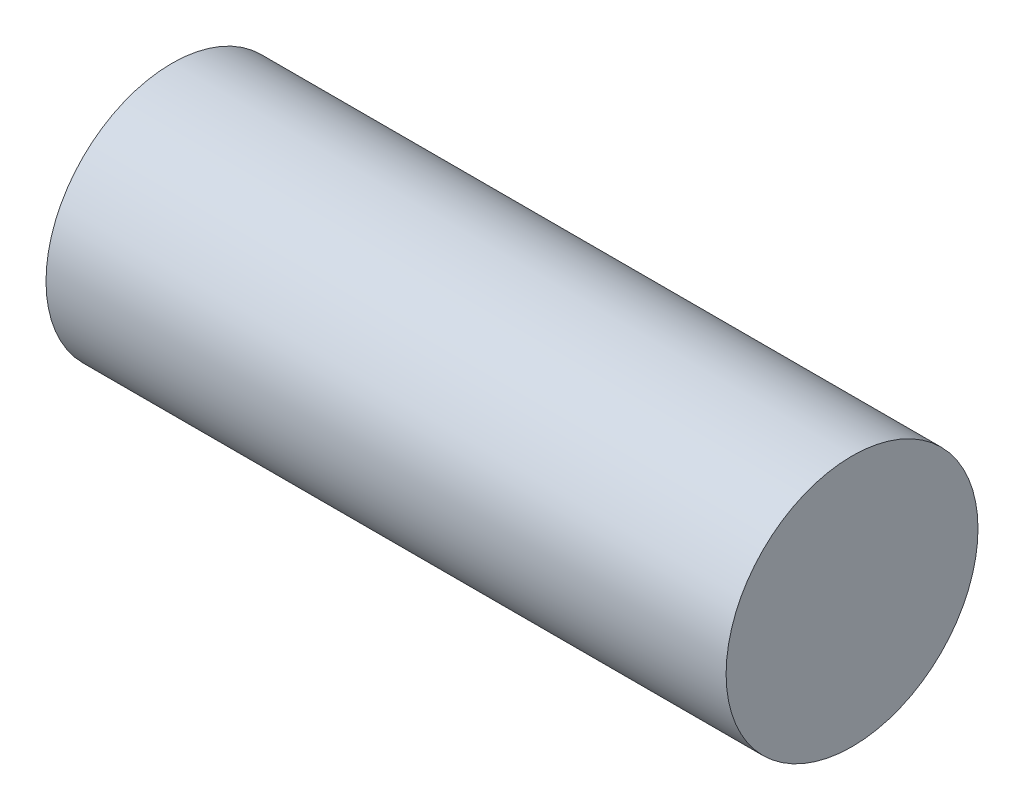
ISO-10303-21;
HEADER;
FILE_DESCRIPTION(('STEP AP214'),'2;1');
FILE_NAME('part.step','',(''),(''),'','','');
FILE_SCHEMA(('AUTOMOTIVE_DESIGN { 1 0 10303 214 1 1 1 1 }'));
ENDSEC;
DATA;
#1=APPLICATION_CONTEXT('core data for automotive mechanical design processes');
#2=APPLICATION_PROTOCOL_DEFINITION('international standard','automotive_design',2000,#1);
#3=PRODUCT_CONTEXT('',#1,'mechanical');
#4=PRODUCT('Part','Part','',(#3));
#5=PRODUCT_RELATED_PRODUCT_CATEGORY('part','',(#4));
#6=PRODUCT_DEFINITION_FORMATION('','',#4);
#7=PRODUCT_DEFINITION_CONTEXT('part definition',#1,'design');
#8=PRODUCT_DEFINITION('design','',#6,#7);
#9=PRODUCT_DEFINITION_SHAPE('','',#8);
#10=(LENGTH_UNIT() NAMED_UNIT(*) SI_UNIT(.MILLI.,.METRE.));
#11=(NAMED_UNIT(*) PLANE_ANGLE_UNIT() SI_UNIT($,.RADIAN.));
#12=(NAMED_UNIT(*) SI_UNIT($,.STERADIAN.) SOLID_ANGLE_UNIT());
#13=UNCERTAINTY_MEASURE_WITH_UNIT(LENGTH_MEASURE(1.E-05),#10,'distance_accuracy_value','');
#14=(GEOMETRIC_REPRESENTATION_CONTEXT(3) GLOBAL_UNCERTAINTY_ASSIGNED_CONTEXT((#13)) GLOBAL_UNIT_ASSIGNED_CONTEXT((#10,
#11,#12)) REPRESENTATION_CONTEXT('',''));
#15=CARTESIAN_POINT('',(0.,0.,0.));
#16=DIRECTION('',(0.,0.,1.));
#17=DIRECTION('',(1.,0.,0.));
#18=AXIS2_PLACEMENT_3D('',#15,#16,#17);
#19=CARTESIAN_POINT('',(27.,0.,0.));
#20=DIRECTION('',(-1.,0.,0.));
#21=DIRECTION('',(0.,0.,1.));
#22=AXIS2_PLACEMENT_3D('',#19,#20,#21);
#23=CYLINDRICAL_SURFACE('',#22,5.);
#24=CARTESIAN_POINT('',(27.,0.,0.));
#25=DIRECTION('',(1.,0.,0.));
#26=DIRECTION('',(0.,0.,-1.));
#27=AXIS2_PLACEMENT_3D('',#24,#25,#26);
#28=CIRCLE('',#27,5.);
#29=CARTESIAN_POINT('',(27.,0.,-5.));
#30=VERTEX_POINT('',#29);
#31=EDGE_CURVE('E10',#30,#30,#28,.T.);
#32=ORIENTED_EDGE('',*,*,#31,.F.);
#33=EDGE_LOOP('',(#32));
#34=FACE_BOUND('',#33,.T.);
#35=CARTESIAN_POINT('',(0.,0.,0.));
#36=DIRECTION('',(1.,0.,0.));
#37=DIRECTION('',(0.,0.,-1.));
#38=AXIS2_PLACEMENT_3D('',#35,#36,#37);
#39=CIRCLE('',#38,5.);
#40=CARTESIAN_POINT('',(0.,0.,-5.));
#41=VERTEX_POINT('',#40);
#42=EDGE_CURVE('E40',#41,#41,#39,.T.);
#43=ORIENTED_EDGE('',*,*,#42,.T.);
#44=EDGE_LOOP('',(#43));
#45=FACE_BOUND('',#44,.T.);
#46=ADVANCED_FACE('F37',(#34,#45),#23,.T.);
#47=CARTESIAN_POINT('',(27.,0.,0.));
#48=DIRECTION('',(1.,0.,0.));
#49=DIRECTION('',(0.,0.,-1.));
#50=AXIS2_PLACEMENT_3D('',#47,#48,#49);
#51=PLANE('',#50);
#52=ORIENTED_EDGE('',*,*,#31,.T.);
#53=EDGE_LOOP('',(#52));
#54=FACE_BOUND('',#53,.T.);
#55=ADVANCED_FACE('F54',(#54),#51,.T.);
#56=CARTESIAN_POINT('',(0.,0.,0.));
#57=DIRECTION('',(1.,0.,0.));
#58=DIRECTION('',(0.,0.,-1.));
#59=AXIS2_PLACEMENT_3D('',#56,#57,#58);
#60=PLANE('',#59);
#61=ORIENTED_EDGE('',*,*,#42,.F.);
#62=EDGE_LOOP('',(#61));
#63=FACE_BOUND('',#62,.T.);
#64=ADVANCED_FACE('F52',(#63),#60,.F.);
#65=CLOSED_SHELL('',(#46,#55,#64));
#66=MANIFOLD_SOLID_BREP('B2',#65);
#67=ADVANCED_BREP_SHAPE_REPRESENTATION('',(#18,#66),#14);
#68=SHAPE_DEFINITION_REPRESENTATION(#9,#67);
ENDSEC;
END-ISO-10303-21;
